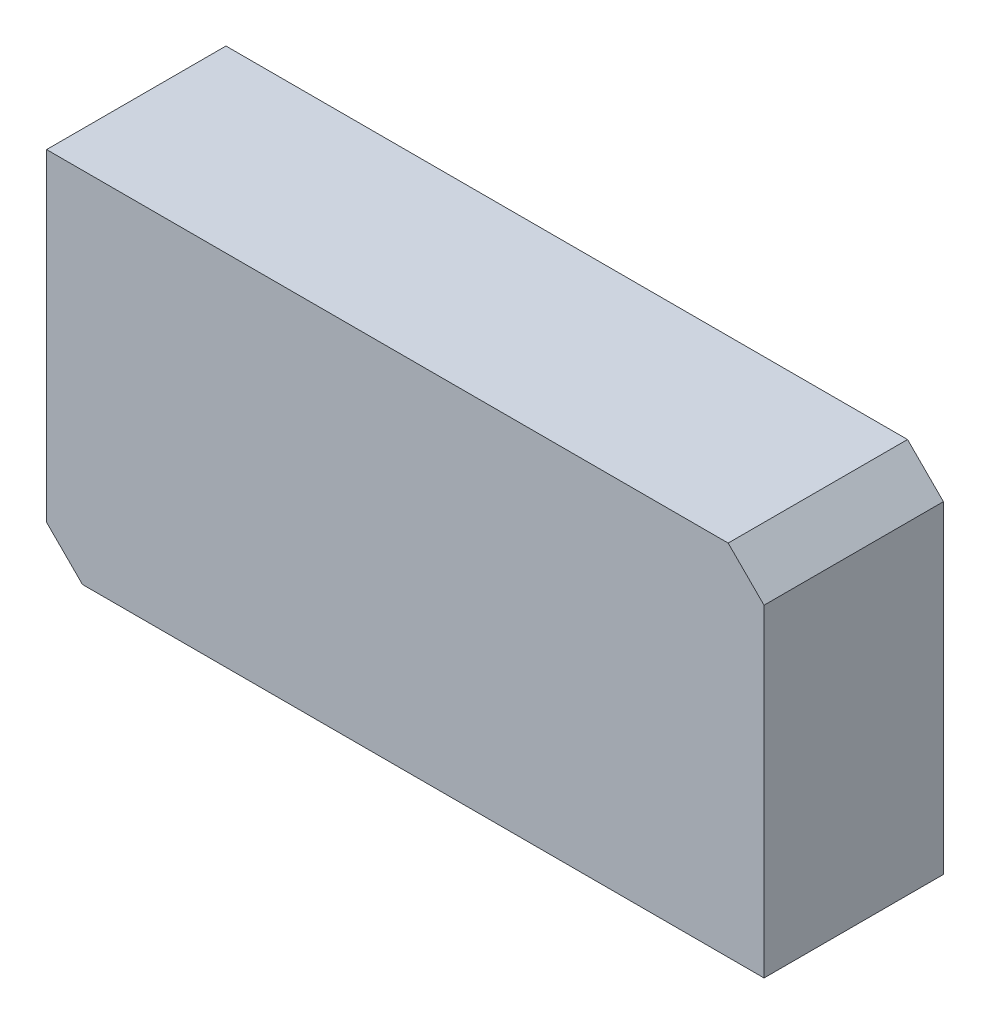
ISO-10303-21;
HEADER;
FILE_DESCRIPTION(('STEP AP214'),'2;1');
FILE_NAME('part.step','',(''),(''),'','','');
FILE_SCHEMA(('AUTOMOTIVE_DESIGN { 1 0 10303 214 1 1 1 1 }'));
ENDSEC;
DATA;
#1=APPLICATION_CONTEXT('core data for automotive mechanical design processes');
#2=APPLICATION_PROTOCOL_DEFINITION('international standard','automotive_design',2000,#1);
#3=PRODUCT_CONTEXT('',#1,'mechanical');
#4=PRODUCT('Part','Part','',(#3));
#5=PRODUCT_RELATED_PRODUCT_CATEGORY('part','',(#4));
#6=PRODUCT_DEFINITION_FORMATION('','',#4);
#7=PRODUCT_DEFINITION_CONTEXT('part definition',#1,'design');
#8=PRODUCT_DEFINITION('design','',#6,#7);
#9=PRODUCT_DEFINITION_SHAPE('','',#8);
#10=(LENGTH_UNIT() NAMED_UNIT(*) SI_UNIT(.MILLI.,.METRE.));
#11=(NAMED_UNIT(*) PLANE_ANGLE_UNIT() SI_UNIT($,.RADIAN.));
#12=(NAMED_UNIT(*) SI_UNIT($,.STERADIAN.) SOLID_ANGLE_UNIT());
#13=UNCERTAINTY_MEASURE_WITH_UNIT(LENGTH_MEASURE(1.E-05),#10,'distance_accuracy_value','');
#14=(GEOMETRIC_REPRESENTATION_CONTEXT(3) GLOBAL_UNCERTAINTY_ASSIGNED_CONTEXT((#13)) GLOBAL_UNIT_ASSIGNED_CONTEXT((#10,
#11,#12)) REPRESENTATION_CONTEXT('',''));
#15=CARTESIAN_POINT('',(0.,0.,0.));
#16=DIRECTION('',(0.,0.,1.));
#17=DIRECTION('',(1.,0.,0.));
#18=AXIS2_PLACEMENT_3D('',#15,#16,#17);
#19=CARTESIAN_POINT('',(0.,20.,10.));
#20=DIRECTION('',(1.,0.,0.));
#21=DIRECTION('',(0.,0.,-1.));
#22=AXIS2_PLACEMENT_3D('',#19,#20,#21);
#23=PLANE('',#22);
#24=DIRECTION('',(0.,-1.,0.));
#25=VECTOR('',#24,1.);
#26=CARTESIAN_POINT('',(0.,20.,0.));
#27=LINE('',#26,#25);
#28=CARTESIAN_POINT('',(0.,20.,0.));
#29=VERTEX_POINT('',#28);
#30=CARTESIAN_POINT('',(0.,2.00000000000001,0.));
#31=VERTEX_POINT('',#30);
#32=EDGE_CURVE('E125',#29,#31,#27,.T.);
#33=ORIENTED_EDGE('',*,*,#32,.T.);
#34=DIRECTION('',(0.,0.,1.));
#35=VECTOR('',#34,1.);
#36=CARTESIAN_POINT('',(0.,2.00000000000001,10.));
#37=LINE('',#36,#35);
#38=CARTESIAN_POINT('',(0.,2.00000000000001,10.));
#39=VERTEX_POINT('',#38);
#40=EDGE_CURVE('E11',#31,#39,#37,.T.);
#41=ORIENTED_EDGE('',*,*,#40,.T.);
#42=DIRECTION('',(0.,-1.,0.));
#43=VECTOR('',#42,1.);
#44=CARTESIAN_POINT('',(0.,20.,10.));
#45=LINE('',#44,#43);
#46=CARTESIAN_POINT('',(0.,20.,10.));
#47=VERTEX_POINT('',#46);
#48=EDGE_CURVE('E104',#47,#39,#45,.T.);
#49=ORIENTED_EDGE('',*,*,#48,.F.);
#50=DIRECTION('',(0.,0.,-1.));
#51=VECTOR('',#50,1.);
#52=CARTESIAN_POINT('',(0.,20.,10.));
#53=LINE('',#52,#51);
#54=EDGE_CURVE('E115',#47,#29,#53,.T.);
#55=ORIENTED_EDGE('',*,*,#54,.T.);
#56=EDGE_LOOP('',(#33,#41,#49,#55));
#57=FACE_BOUND('',#56,.T.);
#58=ADVANCED_FACE('F43',(#57),#23,.F.);
#59=CARTESIAN_POINT('',(0.,0.,10.));
#60=DIRECTION('',(0.,1.,0.));
#61=DIRECTION('',(0.,0.,1.));
#62=AXIS2_PLACEMENT_3D('',#59,#60,#61);
#63=PLANE('',#62);
#64=DIRECTION('',(1.,0.,0.));
#65=VECTOR('',#64,1.);
#66=CARTESIAN_POINT('',(0.,0.,10.));
#67=LINE('',#66,#65);
#68=CARTESIAN_POINT('',(1.99999999999999,0.,10.));
#69=VERTEX_POINT('',#68);
#70=CARTESIAN_POINT('',(40.,0.,10.));
#71=VERTEX_POINT('',#70);
#72=EDGE_CURVE('E95',#69,#71,#67,.T.);
#73=ORIENTED_EDGE('',*,*,#72,.F.);
#74=DIRECTION('',(0.,0.,-1.));
#75=VECTOR('',#74,1.);
#76=CARTESIAN_POINT('',(1.99999999999999,0.,10.));
#77=LINE('',#76,#75);
#78=CARTESIAN_POINT('',(1.99999999999999,0.,0.));
#79=VERTEX_POINT('',#78);
#80=EDGE_CURVE('E52',#69,#79,#77,.T.);
#81=ORIENTED_EDGE('',*,*,#80,.T.);
#82=DIRECTION('',(1.,0.,0.));
#83=VECTOR('',#82,1.);
#84=CARTESIAN_POINT('',(0.,0.,0.));
#85=LINE('',#84,#83);
#86=CARTESIAN_POINT('',(40.,0.,0.));
#87=VERTEX_POINT('',#86);
#88=EDGE_CURVE('E110',#79,#87,#85,.T.);
#89=ORIENTED_EDGE('',*,*,#88,.T.);
#90=DIRECTION('',(0.,0.,-1.));
#91=VECTOR('',#90,1.);
#92=CARTESIAN_POINT('',(40.,0.,10.));
#93=LINE('',#92,#91);
#94=EDGE_CURVE('E107',#71,#87,#93,.T.);
#95=ORIENTED_EDGE('',*,*,#94,.F.);
#96=EDGE_LOOP('',(#73,#81,#89,#95));
#97=FACE_BOUND('',#96,.T.);
#98=ADVANCED_FACE('F108',(#97),#63,.F.);
#99=CARTESIAN_POINT('',(40.,0.,10.));
#100=DIRECTION('',(-1.,0.,0.));
#101=DIRECTION('',(0.,0.,1.));
#102=AXIS2_PLACEMENT_3D('',#99,#100,#101);
#103=PLANE('',#102);
#104=DIRECTION('',(0.,1.,0.));
#105=VECTOR('',#104,1.);
#106=CARTESIAN_POINT('',(40.,0.,0.));
#107=LINE('',#106,#105);
#108=CARTESIAN_POINT('',(40.,18.,0.));
#109=VERTEX_POINT('',#108);
#110=EDGE_CURVE('E128',#87,#109,#107,.T.);
#111=ORIENTED_EDGE('',*,*,#110,.T.);
#112=DIRECTION('',(0.,0.,1.));
#113=VECTOR('',#112,1.);
#114=CARTESIAN_POINT('',(40.,18.,10.));
#115=LINE('',#114,#113);
#116=CARTESIAN_POINT('',(40.,18.,10.));
#117=VERTEX_POINT('',#116);
#118=EDGE_CURVE('E119',#109,#117,#115,.T.);
#119=ORIENTED_EDGE('',*,*,#118,.T.);
#120=DIRECTION('',(0.,1.,0.));
#121=VECTOR('',#120,1.);
#122=CARTESIAN_POINT('',(40.,0.,10.));
#123=LINE('',#122,#121);
#124=EDGE_CURVE('E99',#71,#117,#123,.T.);
#125=ORIENTED_EDGE('',*,*,#124,.F.);
#126=ORIENTED_EDGE('',*,*,#94,.T.);
#127=EDGE_LOOP('',(#111,#119,#125,#126));
#128=FACE_BOUND('',#127,.T.);
#129=ADVANCED_FACE('F117',(#128),#103,.F.);
#130=CARTESIAN_POINT('',(40.,20.,10.));
#131=DIRECTION('',(0.,-1.,0.));
#132=DIRECTION('',(0.,0.,-1.));
#133=AXIS2_PLACEMENT_3D('',#130,#131,#132);
#134=PLANE('',#133);
#135=DIRECTION('',(-1.,0.,0.));
#136=VECTOR('',#135,1.);
#137=CARTESIAN_POINT('',(40.,20.,10.));
#138=LINE('',#137,#136);
#139=CARTESIAN_POINT('',(38.,20.,10.));
#140=VERTEX_POINT('',#139);
#141=EDGE_CURVE('E120',#140,#47,#138,.T.);
#142=ORIENTED_EDGE('',*,*,#141,.F.);
#143=DIRECTION('',(0.,0.,-1.));
#144=VECTOR('',#143,1.);
#145=CARTESIAN_POINT('',(38.,20.,10.));
#146=LINE('',#145,#144);
#147=CARTESIAN_POINT('',(38.,20.,0.));
#148=VERTEX_POINT('',#147);
#149=EDGE_CURVE('E114',#140,#148,#146,.T.);
#150=ORIENTED_EDGE('',*,*,#149,.T.);
#151=DIRECTION('',(-1.,0.,0.));
#152=VECTOR('',#151,1.);
#153=CARTESIAN_POINT('',(40.,20.,0.));
#154=LINE('',#153,#152);
#155=EDGE_CURVE('E130',#148,#29,#154,.T.);
#156=ORIENTED_EDGE('',*,*,#155,.T.);
#157=ORIENTED_EDGE('',*,*,#54,.F.);
#158=EDGE_LOOP('',(#142,#150,#156,#157));
#159=FACE_BOUND('',#158,.T.);
#160=ADVANCED_FACE('F154',(#159),#134,.F.);
#161=CARTESIAN_POINT('',(0.,0.,10.));
#162=DIRECTION('',(0.,0.,1.));
#163=DIRECTION('',(1.,0.,0.));
#164=AXIS2_PLACEMENT_3D('',#161,#162,#163);
#165=PLANE('',#164);
#166=ORIENTED_EDGE('',*,*,#124,.T.);
#167=DIRECTION('',(0.707106781186544,-0.707106781186551,0.));
#168=VECTOR('',#167,1.);
#169=CARTESIAN_POINT('',(29.0000000000002,28.9999999999999,10.));
#170=LINE('',#169,#168);
#171=EDGE_CURVE('E142',#117,#140,#170,.F.);
#172=ORIENTED_EDGE('',*,*,#171,.T.);
#173=ORIENTED_EDGE('',*,*,#141,.T.);
#174=ORIENTED_EDGE('',*,*,#48,.T.);
#175=DIRECTION('',(-0.707106781186544,0.707106781186551,0.));
#176=VECTOR('',#175,1.);
#177=CARTESIAN_POINT('',(1.,0.999999999999994,10.));
#178=LINE('',#177,#176);
#179=EDGE_CURVE('E59',#39,#69,#178,.F.);
#180=ORIENTED_EDGE('',*,*,#179,.T.);
#181=ORIENTED_EDGE('',*,*,#72,.T.);
#182=EDGE_LOOP('',(#166,#172,#173,#174,#180,#181));
#183=FACE_BOUND('',#182,.T.);
#184=ADVANCED_FACE('F97',(#183),#165,.T.);
#185=CARTESIAN_POINT('',(0.,0.,0.));
#186=DIRECTION('',(0.,0.,1.));
#187=DIRECTION('',(1.,0.,0.));
#188=AXIS2_PLACEMENT_3D('',#185,#186,#187);
#189=PLANE('',#188);
#190=ORIENTED_EDGE('',*,*,#155,.F.);
#191=DIRECTION('',(-0.707106781186544,0.707106781186551,0.));
#192=VECTOR('',#191,1.);
#193=CARTESIAN_POINT('',(38.,20.,0.));
#194=LINE('',#193,#192);
#195=EDGE_CURVE('E138',#148,#109,#194,.F.);
#196=ORIENTED_EDGE('',*,*,#195,.T.);
#197=ORIENTED_EDGE('',*,*,#110,.F.);
#198=ORIENTED_EDGE('',*,*,#88,.F.);
#199=DIRECTION('',(0.707106781186544,-0.707106781186551,0.));
#200=VECTOR('',#199,1.);
#201=CARTESIAN_POINT('',(1.99999999999999,0.,0.));
#202=LINE('',#201,#200);
#203=EDGE_CURVE('E136',#79,#31,#202,.F.);
#204=ORIENTED_EDGE('',*,*,#203,.T.);
#205=ORIENTED_EDGE('',*,*,#32,.F.);
#206=EDGE_LOOP('',(#190,#196,#197,#198,#204,#205));
#207=FACE_BOUND('',#206,.T.);
#208=ADVANCED_FACE('F146',(#207),#189,.F.);
#209=CARTESIAN_POINT('',(38.,20.,10.));
#210=DIRECTION('',(-0.707106781186551,-0.707106781186544,0.));
#211=DIRECTION('',(0.,0.,-1.));
#212=AXIS2_PLACEMENT_3D('',#209,#210,#211);
#213=PLANE('',#212);
#214=ORIENTED_EDGE('',*,*,#171,.F.);
#215=ORIENTED_EDGE('',*,*,#118,.F.);
#216=ORIENTED_EDGE('',*,*,#195,.F.);
#217=ORIENTED_EDGE('',*,*,#149,.F.);
#218=EDGE_LOOP('',(#214,#215,#216,#217));
#219=FACE_BOUND('',#218,.T.);
#220=ADVANCED_FACE('F149',(#219),#213,.F.);
#221=CARTESIAN_POINT('',(1.99999999999999,0.,10.));
#222=DIRECTION('',(0.707106781186551,0.707106781186544,0.));
#223=DIRECTION('',(0.,0.,-1.));
#224=AXIS2_PLACEMENT_3D('',#221,#222,#223);
#225=PLANE('',#224);
#226=ORIENTED_EDGE('',*,*,#179,.F.);
#227=ORIENTED_EDGE('',*,*,#40,.F.);
#228=ORIENTED_EDGE('',*,*,#203,.F.);
#229=ORIENTED_EDGE('',*,*,#80,.F.);
#230=EDGE_LOOP('',(#226,#227,#228,#229));
#231=FACE_BOUND('',#230,.T.);
#232=ADVANCED_FACE('F46',(#231),#225,.F.);
#233=CLOSED_SHELL('',(#58,#98,#129,#160,#184,#208,#220,#232));
#234=MANIFOLD_SOLID_BREP('B2',#233);
#235=ADVANCED_BREP_SHAPE_REPRESENTATION('',(#18,#234),#14);
#236=SHAPE_DEFINITION_REPRESENTATION(#9,#235);
ENDSEC;
END-ISO-10303-21;
